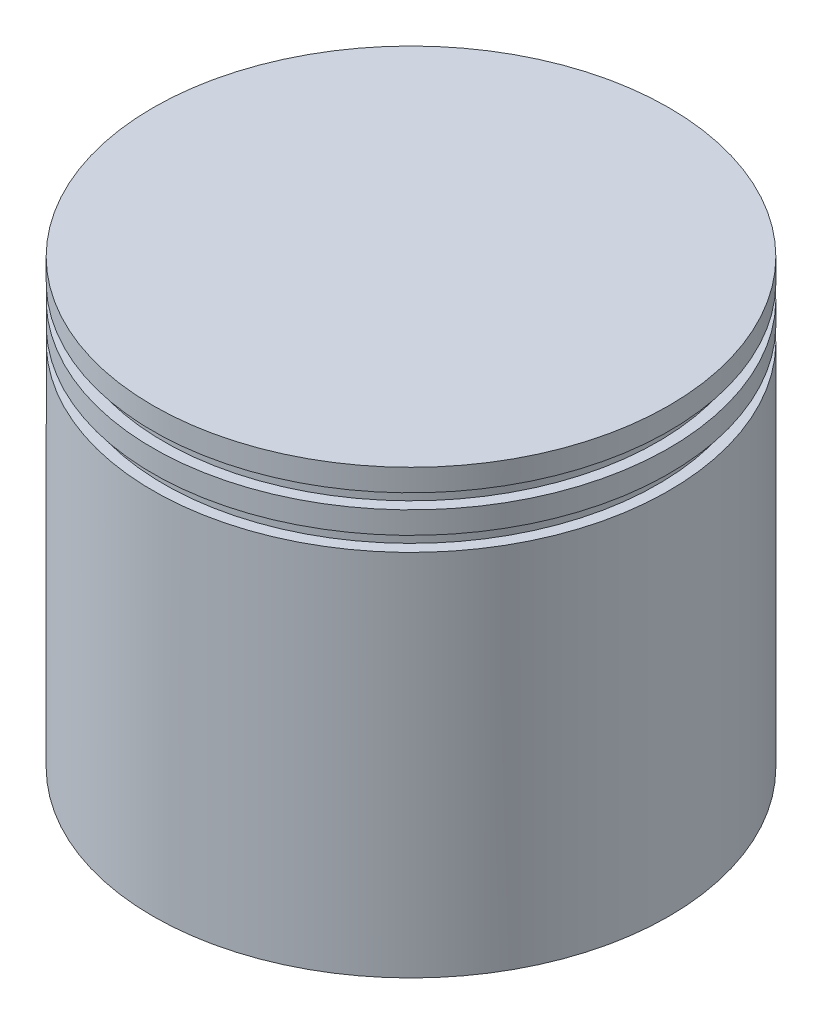
ISO-10303-21;
HEADER;
FILE_DESCRIPTION(('STEP AP214'),'2;1');
FILE_NAME('part.step','',(''),(''),'','','');
FILE_SCHEMA(('AUTOMOTIVE_DESIGN { 1 0 10303 214 1 1 1 1 }'));
ENDSEC;
DATA;
#1=APPLICATION_CONTEXT('core data for automotive mechanical design processes');
#2=APPLICATION_PROTOCOL_DEFINITION('international standard','automotive_design',2000,#1);
#3=PRODUCT_CONTEXT('',#1,'mechanical');
#4=PRODUCT('Part','Part','',(#3));
#5=PRODUCT_RELATED_PRODUCT_CATEGORY('part','',(#4));
#6=PRODUCT_DEFINITION_FORMATION('','',#4);
#7=PRODUCT_DEFINITION_CONTEXT('part definition',#1,'design');
#8=PRODUCT_DEFINITION('design','',#6,#7);
#9=PRODUCT_DEFINITION_SHAPE('','',#8);
#10=(LENGTH_UNIT() NAMED_UNIT(*) SI_UNIT(.MILLI.,.METRE.));
#11=(NAMED_UNIT(*) PLANE_ANGLE_UNIT() SI_UNIT($,.RADIAN.));
#12=(NAMED_UNIT(*) SI_UNIT($,.STERADIAN.) SOLID_ANGLE_UNIT());
#13=UNCERTAINTY_MEASURE_WITH_UNIT(LENGTH_MEASURE(1.E-05),#10,'distance_accuracy_value','');
#14=(GEOMETRIC_REPRESENTATION_CONTEXT(3) GLOBAL_UNCERTAINTY_ASSIGNED_CONTEXT((#13)) GLOBAL_UNIT_ASSIGNED_CONTEXT((#10,
#11,#12)) REPRESENTATION_CONTEXT('',''));
#15=CARTESIAN_POINT('',(0.,0.,0.));
#16=DIRECTION('',(0.,0.,1.));
#17=DIRECTION('',(1.,0.,0.));
#18=AXIS2_PLACEMENT_3D('',#15,#16,#17);
#19=CARTESIAN_POINT('',(0.,60.,0.));
#20=DIRECTION('',(0.,-1.,0.));
#21=DIRECTION('',(0.,0.,-1.));
#22=AXIS2_PLACEMENT_3D('',#19,#20,#21);
#23=CYLINDRICAL_SURFACE('',#22,35.);
#24=CARTESIAN_POINT('',(0.,55.,0.));
#25=DIRECTION('',(0.,-1.,0.));
#26=DIRECTION('',(0.,0.,-1.));
#27=AXIS2_PLACEMENT_3D('',#24,#25,#26);
#28=CIRCLE('',#27,35.);
#29=CARTESIAN_POINT('',(0.,55.,-35.));
#30=VERTEX_POINT('',#29);
#31=EDGE_CURVE('E123',#30,#30,#28,.T.);
#32=ORIENTED_EDGE('',*,*,#31,.T.);
#33=EDGE_LOOP('',(#32));
#34=FACE_BOUND('',#33,.T.);
#35=CARTESIAN_POINT('',(0.,52.,0.));
#36=DIRECTION('',(0.,-1.,0.));
#37=DIRECTION('',(0.,0.,-1.));
#38=AXIS2_PLACEMENT_3D('',#35,#36,#37);
#39=CIRCLE('',#38,35.);
#40=CARTESIAN_POINT('',(0.,52.,-35.));
#41=VERTEX_POINT('',#40);
#42=EDGE_CURVE('E165',#41,#41,#39,.T.);
#43=ORIENTED_EDGE('',*,*,#42,.F.);
#44=EDGE_LOOP('',(#43));
#45=FACE_BOUND('',#44,.T.);
#46=ADVANCED_FACE('F36',(#34,#45),#23,.T.);
#47=CARTESIAN_POINT('',(0.,47.5422284208895,0.));
#48=DIRECTION('',(0.,-1.,0.));
#49=DIRECTION('',(0.,0.,-1.));
#50=AXIS2_PLACEMENT_3D('',#47,#48,#49);
#51=CYLINDRICAL_SURFACE('',#50,33.5);
#52=CARTESIAN_POINT('',(0.,57.,0.));
#53=DIRECTION('',(0.,-1.,0.));
#54=DIRECTION('',(0.,0.,-1.));
#55=AXIS2_PLACEMENT_3D('',#52,#53,#54);
#56=CIRCLE('',#55,33.5);
#57=CARTESIAN_POINT('',(0.,57.,-33.5));
#58=VERTEX_POINT('',#57);
#59=EDGE_CURVE('E122',#58,#58,#56,.T.);
#60=ORIENTED_EDGE('',*,*,#59,.T.);
#61=EDGE_LOOP('',(#60));
#62=FACE_BOUND('',#61,.T.);
#63=CARTESIAN_POINT('',(0.,55.,0.));
#64=DIRECTION('',(0.,-1.,0.));
#65=DIRECTION('',(0.,0.,-1.));
#66=AXIS2_PLACEMENT_3D('',#63,#64,#65);
#67=CIRCLE('',#66,33.5);
#68=CARTESIAN_POINT('',(0.,55.,-33.5));
#69=VERTEX_POINT('',#68);
#70=EDGE_CURVE('E128',#69,#69,#67,.T.);
#71=ORIENTED_EDGE('',*,*,#70,.F.);
#72=EDGE_LOOP('',(#71));
#73=FACE_BOUND('',#72,.T.);
#74=ADVANCED_FACE('F92',(#62,#73),#51,.T.);
#75=CARTESIAN_POINT('',(-33.5,57.,0.));
#76=DIRECTION('',(0.,-1.,0.));
#77=DIRECTION('',(0.,0.,-1.));
#78=AXIS2_PLACEMENT_3D('',#75,#76,#77);
#79=PLANE('',#78);
#80=CARTESIAN_POINT('',(0.,57.,0.));
#81=DIRECTION('',(0.,-1.,0.));
#82=DIRECTION('',(0.,0.,-1.));
#83=AXIS2_PLACEMENT_3D('',#80,#81,#82);
#84=CIRCLE('',#83,35.);
#85=CARTESIAN_POINT('',(0.,57.,-35.));
#86=VERTEX_POINT('',#85);
#87=EDGE_CURVE('E120',#86,#86,#84,.T.);
#88=ORIENTED_EDGE('',*,*,#87,.T.);
#89=EDGE_LOOP('',(#88));
#90=FACE_BOUND('',#89,.T.);
#91=ORIENTED_EDGE('',*,*,#59,.F.);
#92=EDGE_LOOP('',(#91));
#93=FACE_BOUND('',#92,.T.);
#94=ADVANCED_FACE('F98',(#90,#93),#79,.T.);
#95=CARTESIAN_POINT('',(-35.,55.,0.));
#96=DIRECTION('',(0.,1.,0.));
#97=DIRECTION('',(0.,0.,1.));
#98=AXIS2_PLACEMENT_3D('',#95,#96,#97);
#99=PLANE('',#98);
#100=ORIENTED_EDGE('',*,*,#70,.T.);
#101=EDGE_LOOP('',(#100));
#102=FACE_BOUND('',#101,.T.);
#103=ORIENTED_EDGE('',*,*,#31,.F.);
#104=EDGE_LOOP('',(#103));
#105=FACE_BOUND('',#104,.T.);
#106=ADVANCED_FACE('F116',(#102,#105),#99,.T.);
#107=CARTESIAN_POINT('',(0.,60.,0.));
#108=DIRECTION('',(0.,1.,0.));
#109=DIRECTION('',(0.,0.,1.));
#110=AXIS2_PLACEMENT_3D('',#107,#108,#109);
#111=PLANE('',#110);
#112=CARTESIAN_POINT('',(0.,60.,0.));
#113=DIRECTION('',(0.,1.,0.));
#114=DIRECTION('',(0.,0.,1.));
#115=AXIS2_PLACEMENT_3D('',#112,#113,#114);
#116=CIRCLE('',#115,35.);
#117=CARTESIAN_POINT('',(0.,60.,35.));
#118=VERTEX_POINT('',#117);
#119=EDGE_CURVE('E10',#118,#118,#116,.T.);
#120=ORIENTED_EDGE('',*,*,#119,.T.);
#121=EDGE_LOOP('',(#120));
#122=FACE_BOUND('',#121,.T.);
#123=ADVANCED_FACE('F107',(#122),#111,.T.);
#124=ORIENTED_EDGE('',*,*,#119,.F.);
#125=EDGE_LOOP('',(#124));
#126=FACE_BOUND('',#125,.T.);
#127=ORIENTED_EDGE('',*,*,#87,.F.);
#128=EDGE_LOOP('',(#127));
#129=FACE_BOUND('',#128,.T.);
#130=ADVANCED_FACE('F38',(#126,#129),#23,.T.);
#131=CARTESIAN_POINT('',(0.,47.5422284208895,0.));
#132=DIRECTION('',(0.,-1.,0.));
#133=DIRECTION('',(0.,0.,-1.));
#134=AXIS2_PLACEMENT_3D('',#131,#132,#133);
#135=CYLINDRICAL_SURFACE('',#134,33.5);
#136=CARTESIAN_POINT('',(0.,52.,0.));
#137=DIRECTION('',(0.,-1.,0.));
#138=DIRECTION('',(0.,0.,-1.));
#139=AXIS2_PLACEMENT_3D('',#136,#137,#138);
#140=CIRCLE('',#139,33.5);
#141=CARTESIAN_POINT('',(0.,52.,-33.5));
#142=VERTEX_POINT('',#141);
#143=EDGE_CURVE('E168',#142,#142,#140,.T.);
#144=ORIENTED_EDGE('',*,*,#143,.T.);
#145=EDGE_LOOP('',(#144));
#146=FACE_BOUND('',#145,.T.);
#147=CARTESIAN_POINT('',(0.,50.,0.));
#148=DIRECTION('',(0.,-1.,0.));
#149=DIRECTION('',(0.,0.,-1.));
#150=AXIS2_PLACEMENT_3D('',#147,#148,#149);
#151=CIRCLE('',#150,33.5);
#152=CARTESIAN_POINT('',(0.,50.,-33.5));
#153=VERTEX_POINT('',#152);
#154=EDGE_CURVE('E160',#153,#153,#151,.T.);
#155=ORIENTED_EDGE('',*,*,#154,.F.);
#156=EDGE_LOOP('',(#155));
#157=FACE_BOUND('',#156,.T.);
#158=ADVANCED_FACE('F106',(#146,#157),#135,.T.);
#159=CARTESIAN_POINT('',(-33.5,52.,0.));
#160=DIRECTION('',(0.,-1.,0.));
#161=DIRECTION('',(0.,0.,-1.));
#162=AXIS2_PLACEMENT_3D('',#159,#160,#161);
#163=PLANE('',#162);
#164=ORIENTED_EDGE('',*,*,#42,.T.);
#165=EDGE_LOOP('',(#164));
#166=FACE_BOUND('',#165,.T.);
#167=ORIENTED_EDGE('',*,*,#143,.F.);
#168=EDGE_LOOP('',(#167));
#169=FACE_BOUND('',#168,.T.);
#170=ADVANCED_FACE('F113',(#166,#169),#163,.T.);
#171=CARTESIAN_POINT('',(-35.,50.,0.));
#172=DIRECTION('',(0.,1.,0.));
#173=DIRECTION('',(0.,0.,1.));
#174=AXIS2_PLACEMENT_3D('',#171,#172,#173);
#175=PLANE('',#174);
#176=ORIENTED_EDGE('',*,*,#154,.T.);
#177=EDGE_LOOP('',(#176));
#178=FACE_BOUND('',#177,.T.);
#179=CARTESIAN_POINT('',(0.,50.,0.));
#180=DIRECTION('',(0.,-1.,0.));
#181=DIRECTION('',(0.,0.,-1.));
#182=AXIS2_PLACEMENT_3D('',#179,#180,#181);
#183=CIRCLE('',#182,35.);
#184=CARTESIAN_POINT('',(0.,50.,-35.));
#185=VERTEX_POINT('',#184);
#186=EDGE_CURVE('E163',#185,#185,#183,.T.);
#187=ORIENTED_EDGE('',*,*,#186,.F.);
#188=EDGE_LOOP('',(#187));
#189=FACE_BOUND('',#188,.T.);
#190=ADVANCED_FACE('F149',(#178,#189),#175,.T.);
#191=CARTESIAN_POINT('',(-8.,15.,0.));
#192=DIRECTION('',(1.,0.,0.));
#193=DIRECTION('',(0.,0.,-1.));
#194=AXIS2_PLACEMENT_3D('',#191,#192,#193);
#195=CYLINDRICAL_SURFACE('',#194,3.);
#196=CARTESIAN_POINT('',(-8.,15.,0.));
#197=DIRECTION('',(1.,0.,0.));
#198=DIRECTION('',(0.,0.,-1.));
#199=AXIS2_PLACEMENT_3D('',#196,#197,#198);
#200=CIRCLE('',#199,3.);
#201=CARTESIAN_POINT('',(-8.,15.,-3.));
#202=VERTEX_POINT('',#201);
#203=EDGE_CURVE('E65',#202,#202,#200,.T.);
#204=ORIENTED_EDGE('',*,*,#203,.T.);
#205=EDGE_LOOP('',(#204));
#206=FACE_BOUND('',#205,.T.);
#207=CARTESIAN_POINT('',(8.,15.,0.));
#208=DIRECTION('',(1.,0.,0.));
#209=DIRECTION('',(0.,0.,-1.));
#210=AXIS2_PLACEMENT_3D('',#207,#208,#209);
#211=CIRCLE('',#210,3.);
#212=CARTESIAN_POINT('',(8.,15.,-3.));
#213=VERTEX_POINT('',#212);
#214=EDGE_CURVE('E188',#213,#213,#211,.T.);
#215=ORIENTED_EDGE('',*,*,#214,.F.);
#216=EDGE_LOOP('',(#215));
#217=FACE_BOUND('',#216,.T.);
#218=ADVANCED_FACE('F73',(#206,#217),#195,.T.);
#219=CARTESIAN_POINT('',(8.,15.,0.));
#220=DIRECTION('',(1.,0.,0.));
#221=DIRECTION('',(0.,0.,1.));
#222=AXIS2_PLACEMENT_3D('',#219,#220,#221);
#223=PLANE('',#222);
#224=ORIENTED_EDGE('',*,*,#214,.T.);
#225=EDGE_LOOP('',(#224));
#226=FACE_BOUND('',#225,.T.);
#227=CARTESIAN_POINT('',(8.,15.,0.));
#228=DIRECTION('',(-1.,0.,0.));
#229=DIRECTION('',(0.,0.,1.));
#230=AXIS2_PLACEMENT_3D('',#227,#228,#229);
#231=CIRCLE('',#230,6.);
#232=CARTESIAN_POINT('',(8.,15.,6.));
#233=VERTEX_POINT('',#232);
#234=EDGE_CURVE('E137',#233,#233,#231,.T.);
#235=ORIENTED_EDGE('',*,*,#234,.T.);
#236=EDGE_LOOP('',(#235));
#237=FACE_BOUND('',#236,.T.);
#238=ADVANCED_FACE('F78',(#226,#237),#223,.F.);
#239=CARTESIAN_POINT('',(-8.,15.,0.));
#240=DIRECTION('',(-1.,0.,0.));
#241=DIRECTION('',(0.,0.,1.));
#242=AXIS2_PLACEMENT_3D('',#239,#240,#241);
#243=PLANE('',#242);
#244=ORIENTED_EDGE('',*,*,#203,.F.);
#245=EDGE_LOOP('',(#244));
#246=FACE_BOUND('',#245,.T.);
#247=CARTESIAN_POINT('',(-8.,15.,0.));
#248=DIRECTION('',(-1.,0.,0.));
#249=DIRECTION('',(0.,0.,1.));
#250=AXIS2_PLACEMENT_3D('',#247,#248,#249);
#251=CIRCLE('',#250,6.);
#252=CARTESIAN_POINT('',(-8.,15.,6.));
#253=VERTEX_POINT('',#252);
#254=EDGE_CURVE('E55',#253,#253,#251,.T.);
#255=ORIENTED_EDGE('',*,*,#254,.F.);
#256=EDGE_LOOP('',(#255));
#257=FACE_BOUND('',#256,.T.);
#258=ADVANCED_FACE('F75',(#246,#257),#243,.F.);
#259=CARTESIAN_POINT('',(8.,15.,0.));
#260=DIRECTION('',(1.,0.,0.));
#261=DIRECTION('',(0.,0.,1.));
#262=AXIS2_PLACEMENT_3D('',#259,#260,#261);
#263=CONICAL_SURFACE('',#262,6.,0.139626340159547);
#264=CARTESIAN_POINT('',(31.2669133575195,8.71097222824434,-6.81029581540872));
#265=CARTESIAN_POINT('',(31.2289270924786,8.90769739943283,-6.98469552802213));
#266=CARTESIAN_POINT('',(31.19121991681,9.11186141180421,-7.15079573593364));
#267=CARTESIAN_POINT('',(31.1174354036274,9.533663360001,-7.46534165270167));
#268=CARTESIAN_POINT('',(31.081358249566,9.75130280593344,-7.61378537744265));
#269=CARTESIAN_POINT('',(31.0118555768524,10.198677203922,-7.89211016960158));
#270=CARTESIAN_POINT('',(30.97843114749,10.4284170610137,-8.02198362887102));
#271=CARTESIAN_POINT('',(30.9152262136057,10.8983571251811,-8.26221664255108));
#272=CARTESIAN_POINT('',(30.8854456068352,11.1385570384824,-8.37257674456163));
#273=CARTESIAN_POINT('',(30.8303913121144,11.6279783769724,-8.57308563298544));
#274=CARTESIAN_POINT('',(30.8051212135618,11.877206798878,-8.66321833727193));
#275=CARTESIAN_POINT('',(30.7598864750898,12.3827607284156,-8.82248520301029));
#276=CARTESIAN_POINT('',(30.7399218730203,12.6390862866648,-8.89161921465627));
#277=CARTESIAN_POINT('',(30.705923661776,13.1569162619396,-9.00832677718765));
#278=CARTESIAN_POINT('',(30.6918884535173,13.4184192627315,-9.05590614134431));
#279=CARTESIAN_POINT('',(30.6701852981001,13.944737653792,-9.12914004789619));
#280=CARTESIAN_POINT('',(30.6625172204194,14.2095529760472,-9.15479503972732));
#281=CARTESIAN_POINT('',(30.6538803437074,14.7351691794445,-9.18367245246466));
#282=CARTESIAN_POINT('',(30.6527800163904,14.9959437931424,-9.18733530527482));
#283=CARTESIAN_POINT('',(30.6569612208767,15.5168688451235,-9.17337354330755));
#284=CARTESIAN_POINT('',(30.6622426710724,15.7770192913456,-9.15574920074187));
#285=CARTESIAN_POINT('',(30.6790248804172,16.2948149154097,-9.09935680214171));
#286=CARTESIAN_POINT('',(30.6905256832861,16.5524600756276,-9.06058859747375));
#287=CARTESIAN_POINT('',(30.7193958220612,17.0634051831135,-8.9622175300404));
#288=CARTESIAN_POINT('',(30.7367651714537,17.3167051203945,-8.90261461939552));
#289=CARTESIAN_POINT('',(30.7766912289919,17.8152051606238,-8.76358706988813));
#290=CARTESIAN_POINT('',(30.7992057482668,18.0604535372428,-8.68432321660905));
#291=CARTESIAN_POINT('',(30.8488521604924,18.5433784042536,-8.50628340685762));
#292=CARTESIAN_POINT('',(30.8759857242126,18.7810521177272,-8.40750038795919));
#293=CARTESIAN_POINT('',(30.9340913110962,19.2471695442164,-8.19112536964277));
#294=CARTESIAN_POINT('',(30.9650631160527,19.4756137809566,-8.07353443935858));
#295=CARTESIAN_POINT('',(31.0299848578224,19.9218330131113,-7.82030168427036));
#296=CARTESIAN_POINT('',(31.0639349225328,20.1396075497044,-7.68465908413382));
#297=CARTESIAN_POINT('',(31.1347044720203,20.5680647633367,-7.39278331221115));
#298=CARTESIAN_POINT('',(31.1715725669782,20.7784614965762,-7.23614197635073));
#299=CARTESIAN_POINT('',(31.2464135325355,21.1852160179394,-6.90581726846753));
#300=CARTESIAN_POINT('',(31.2843864196427,21.3815735961396,-6.73213364170826));
#301=CARTESIAN_POINT('',(31.3603769925228,21.7589263925239,-6.36876774160822));
#302=CARTESIAN_POINT('',(31.3983946833646,21.9399196600656,-6.17908344290974));
#303=CARTESIAN_POINT('',(31.4734029882944,22.2852144180093,-5.78490659135343));
#304=CARTESIAN_POINT('',(31.5103936465101,22.4495166263711,-5.58041467608841));
#305=CARTESIAN_POINT('',(31.5825489611336,22.7612446961346,-5.15646545956778));
#306=CARTESIAN_POINT('',(31.6176996367911,22.9085494037604,-4.9369166174229));
#307=CARTESIAN_POINT('',(31.6848737151155,23.1837337285917,-4.48562056980855));
#308=CARTESIAN_POINT('',(31.7168983242673,23.3116208505563,-4.25387812395071));
#309=CARTESIAN_POINT('',(31.7768917146779,23.5469128783071,-3.77971550459227));
#310=CARTESIAN_POINT('',(31.8048606217437,23.65431841946,-3.53729566260641));
#311=CARTESIAN_POINT('',(31.8559018759286,23.8476380938969,-3.04353393683381));
#312=CARTESIAN_POINT('',(31.8789744346647,23.9335531560146,-2.79219243918367));
#313=CARTESIAN_POINT('',(31.9187201774835,24.0800999001998,-2.29251625603737));
#314=CARTESIAN_POINT('',(31.935609002169,24.1415916372772,-2.04445079641348));
#315=CARTESIAN_POINT('',(31.9637277268952,24.2433490452008,-1.54369156247682));
#316=CARTESIAN_POINT('',(31.9749578809718,24.2836156689139,-1.29099799646245));
#317=CARTESIAN_POINT('',(31.9914291642399,24.3425111733418,-0.78296642076948));
#318=CARTESIAN_POINT('',(31.9966716876353,24.3611450911909,-0.527629040674232));
#319=CARTESIAN_POINT('',(32.0010173398055,24.3765987135603,-0.0162451611186606));
#320=CARTESIAN_POINT('',(32.0001206272969,24.3734189820248,0.239801319838341));
#321=CARTESIAN_POINT('',(31.9923821151938,24.3458738480936,0.73984494363145));
#322=CARTESIAN_POINT('',(31.9857919395917,24.3224050948655,0.983895944246808));
#323=CARTESIAN_POINT('',(31.9671794513667,24.2556952280171,1.46915323440687));
#324=CARTESIAN_POINT('',(31.9551553352124,24.2124475496911,1.7103585521706));
#325=CARTESIAN_POINT('',(31.9259994389556,24.1065868190905,2.18811098652399));
#326=CARTESIAN_POINT('',(31.9088686644044,24.0439775792072,2.424659010414));
#327=CARTESIAN_POINT('',(31.8699500960674,23.8999425987695,2.89156874250842));
#328=CARTESIAN_POINT('',(31.8481620625241,23.8185158894674,3.12193013153505));
#329=CARTESIAN_POINT('',(31.8003408081456,23.6369499435649,3.57643418760785));
#330=CARTESIAN_POINT('',(31.7742811319443,23.5366934862926,3.80052720584974));
#331=CARTESIAN_POINT('',(31.7186883971965,23.3186219582311,4.23954868759276));
#332=CARTESIAN_POINT('',(31.6891552677275,23.2008065289025,4.45447696384226));
#333=CARTESIAN_POINT('',(31.6273576285827,22.9484862742698,4.87393097580871));
#334=CARTESIAN_POINT('',(31.5950926862895,22.8139788039918,5.07845505564807));
#335=CARTESIAN_POINT('',(31.5286369698554,22.5292358097785,5.47591628048144));
#336=CARTESIAN_POINT('',(31.4944461136729,22.3789996155835,5.66885293114001));
#337=CARTESIAN_POINT('',(31.4233755379448,22.0565234370966,6.05069465116879));
#338=CARTESIAN_POINT('',(31.3864445346649,21.883588183973,6.23900335816001));
#339=CARTESIAN_POINT('',(31.3123797219467,21.5227885872562,6.6006787578219));
#340=CARTESIAN_POINT('',(31.2752459115385,21.3349241722041,6.77404537896362));
#341=CARTESIAN_POINT('',(31.2017567056485,20.9454583196754,7.10486466463057));
#342=CARTESIAN_POINT('',(31.1654014765316,20.7438539840343,7.26231395420835));
#343=CARTESIAN_POINT('',(31.0944530499085,20.328238620007,7.56032124850495));
#344=CARTESIAN_POINT('',(31.05985983475,20.1142277159582,7.70087942246162));
#345=CARTESIAN_POINT('',(30.9922503198093,19.6677288384447,7.96869769491035));
#346=CARTESIAN_POINT('',(30.9593266946461,19.4348609843097,8.09534858822398));
#347=CARTESIAN_POINT('',(30.8973485212326,18.9589780163798,8.32877182173417));
#348=CARTESIAN_POINT('',(30.8682925689245,18.7159666272454,8.43555138133478));
#349=CARTESIAN_POINT('',(30.8149073824114,18.2213697863034,8.62852913199059));
#350=CARTESIAN_POINT('',(30.7905786072819,17.9697835045388,8.71472532429681));
#351=CARTESIAN_POINT('',(30.7474006685858,17.4598474317218,8.8658635920297));
#352=CARTESIAN_POINT('',(30.7285513927962,17.2014977793051,8.93080610274655));
#353=CARTESIAN_POINT('',(30.6971028830649,16.6828718877164,9.03830620429702));
#354=CARTESIAN_POINT('',(30.6844352431112,16.4226506578031,9.08110912528261));
#355=CARTESIAN_POINT('',(30.6654287877197,15.8993319943191,9.14508585342006));
#356=CARTESIAN_POINT('',(30.6590899378235,15.6362345764165,9.1662597783355));
#357=CARTESIAN_POINT('',(30.6529411829611,15.1091437561746,9.18680099756125));
#358=CARTESIAN_POINT('',(30.6531305302854,14.8451504599083,9.18617078921619));
#359=CARTESIAN_POINT('',(30.660030462963,14.3182055328942,9.16311500125505));
#360=CARTESIAN_POINT('',(30.6667409677139,14.0552538893116,9.14068969102925));
#361=CARTESIAN_POINT('',(30.6862635258484,13.5378402476333,9.07493109132999));
#362=CARTESIAN_POINT('',(30.6989443315491,13.2833159911674,9.03204729237255));
#363=CARTESIAN_POINT('',(30.7299730516425,12.7789094187389,8.92590663147942));
#364=CARTESIAN_POINT('',(30.748320878986,12.5290270315366,8.86265008248173));
#365=CARTESIAN_POINT('',(30.7901423151838,12.035629941272,8.71624486860085));
#366=CARTESIAN_POINT('',(30.8136154316446,11.7921146290309,8.63309811452366));
#367=CARTESIAN_POINT('',(30.8650213358647,11.3129533374161,8.44746881121354));
#368=CARTESIAN_POINT('',(30.89295580469,11.0773103650226,8.34497897072685));
#369=CARTESIAN_POINT('',(30.9528564982914,10.6126682287624,8.11999908722804));
#370=CARTESIAN_POINT('',(30.9848681754406,10.3837867616586,7.997278087589));
#371=CARTESIAN_POINT('',(31.051751702352,9.93716221046358,7.73351318746147));
#372=CARTESIAN_POINT('',(31.0866246202979,9.71942333593404,7.59246243236665));
#373=CARTESIAN_POINT('',(31.1582391908304,9.29663991670172,7.2929978958213));
#374=CARTESIAN_POINT('',(31.1949803851802,9.09159228628137,7.13458836109771));
#375=CARTESIAN_POINT('',(31.2693452043964,8.69538686368291,6.80126570816783));
#376=CARTESIAN_POINT('',(31.3069692308689,8.50423556167469,6.62634496508058));
#377=CARTESIAN_POINT('',(31.382852921056,8.13330874251123,6.25721874428566));
#378=CARTESIAN_POINT('',(31.4211090822171,7.95386168707689,6.06268220485738));
#379=CARTESIAN_POINT('',(31.4963398994854,7.61230883397021,5.6588626444497));
#380=CARTESIAN_POINT('',(31.533315146892,7.45019496080071,5.44958656664231));
#381=CARTESIAN_POINT('',(31.6049529737248,7.14441648765895,5.01746166933311));
#382=CARTESIAN_POINT('',(31.6396146760262,7.00075886605385,4.79460776268793));
#383=CARTESIAN_POINT('',(31.7055835050814,6.73322213670183,4.3369784861628));
#384=CARTESIAN_POINT('',(31.736892101811,6.60933435024234,4.10220840732442));
#385=CARTESIAN_POINT('',(31.7946671427779,6.38460511494442,3.62702200533219));
#386=CARTESIAN_POINT('',(31.8212167255224,6.28335824298906,3.38680760705423));
#387=CARTESIAN_POINT('',(31.869430523408,6.10183459778511,2.89821053401953));
#388=CARTESIAN_POINT('',(31.8910967506215,6.02154918568938,2.64983127191789));
#389=CARTESIAN_POINT('',(31.9289109313163,5.88268795760115,2.14669033946648));
#390=CARTESIAN_POINT('',(31.9450595013453,5.82410971596931,1.89192938562909));
#391=CARTESIAN_POINT('',(31.9713519772954,5.72925446620192,1.37798555126154));
#392=CARTESIAN_POINT('',(31.9814961381737,5.69297651115705,1.11880285896653));
#393=CARTESIAN_POINT('',(31.9951282729915,5.64432450605247,0.610847377174154));
#394=CARTESIAN_POINT('',(31.9989176712889,5.63086760734914,0.362185814694014));
#395=CARTESIAN_POINT('',(32.0006805735169,5.62460045988967,-0.135416099335626));
#396=CARTESIAN_POINT('',(31.9986542144152,5.63178972489249,-0.384356444181456));
#397=CARTESIAN_POINT('',(31.988842462799,5.66674319211337,-0.880660941853176));
#398=CARTESIAN_POINT('',(31.9810573025178,5.69450656464603,-1.1280251578334));
#399=CARTESIAN_POINT('',(31.9599449881652,5.77033781303555,-1.6193783551113));
#400=CARTESIAN_POINT('',(31.9466178539269,5.81840561622943,-1.86336734848458));
#401=CARTESIAN_POINT('',(31.9150803447505,5.93332974493643,-2.34181069185626));
#402=CARTESIAN_POINT('',(31.8969637235964,5.99982642098109,-2.57635780813148));
#403=CARTESIAN_POINT('',(31.8562098728452,6.15139767013774,-3.03905458919401));
#404=CARTESIAN_POINT('',(31.833571042979,6.23647882071752,-3.26720195662338));
#405=CARTESIAN_POINT('',(31.7843714986202,6.42444973292826,-3.71544702950519));
#406=CARTESIAN_POINT('',(31.7578128791119,6.52732998661721,-3.935548957029));
#407=CARTESIAN_POINT('',(31.7014237781234,6.75016568746882,-4.3665762460893));
#408=CARTESIAN_POINT('',(31.6715923388964,6.87012613599691,-4.5774988960773));
#409=CARTESIAN_POINT('',(31.6119739100872,7.11562936854916,-4.97187467587696));
#410=CARTESIAN_POINT('',(31.582386963535,7.23989164472569,-5.15615743863837));
#411=CARTESIAN_POINT('',(31.5216922579737,7.50130924740845,-5.5150742431728));
#412=CARTESIAN_POINT('',(31.4905845032737,7.6384645373857,-5.68970831228065));
#413=CARTESIAN_POINT('',(31.4274698293683,7.92495789544877,-6.02858674368817));
#414=CARTESIAN_POINT('',(31.3954626703068,8.07429923395832,-6.19282829576587));
#415=CARTESIAN_POINT('',(31.3312085457334,8.38432083410536,-6.51011302325786));
#416=CARTESIAN_POINT('',(31.2989616241946,8.54499906028,-6.66315819890725));
#417=CARTESIAN_POINT('',(31.2669133575195,8.71097222824434,-6.81029581540872));
#418=B_SPLINE_CURVE_WITH_KNOTS('',3,(#264,#265,#266,#267,#268,#269,#270,#271,#272,#273,#274,
#275,#276,#277,#278,#279,#280,#281,#282,#283,#284,#285,#286,#287,#288,#289,#290,#291,#292,#293,
#294,#295,#296,#297,#298,#299,#300,#301,#302,#303,#304,#305,#306,#307,#308,#309,#310,#311,#312,
#313,#314,#315,#316,#317,#318,#319,#320,#321,#322,#323,#324,#325,#326,#327,#328,#329,#330,#331,
#332,#333,#334,#335,#336,#337,#338,#339,#340,#341,#342,#343,#344,#345,#346,#347,#348,#349,#350,
#351,#352,#353,#354,#355,#356,#357,#358,#359,#360,#361,#362,#363,#364,#365,#366,#367,#368,#369,
#370,#371,#372,#373,#374,#375,#376,#377,#378,#379,#380,#381,#382,#383,#384,#385,#386,#387,#388,
#389,#390,#391,#392,#393,#394,#395,#396,#397,#398,#399,#400,#401,#402,#403,#404,#405,#406,#407,
#408,#409,#410,#411,#412,#413,#414,#415,#416,#417),.UNSPECIFIED.,.T.,.F.,(4,2,2,2,2,2,2,2,2,2,2,
2,2,2,2,2,2,2,2,2,2,2,2,2,2,2,2,2,2,2,2,2,2,2,2,2,2,2,2,2,2,2,2,2,2,2,2,2,2,2,2,2,2,2,2,2,2,2,2,
2,2,2,2,2,2,2,2,2,2,2,2,2,2,2,2,2,4),(0.,0.796691179799454,1.59347180192511,2.39057793161639,
3.18766168870689,3.98537695273893,4.78309790758442,5.58060358945436,6.37809292256451,
7.15955636811456,7.94100982074265,8.72246876676807,9.50392950864819,10.2791988679572,
11.0547492506305,11.8302555628797,12.6057951944529,13.39951607318,14.19324881771,
14.9870821837643,15.7808813888978,16.580028444825,17.378865845533,18.1776784611761,
18.9764565456055,19.7438808725294,20.5112707442501,21.2784818948363,22.0456732109272,
22.780598077829,23.5157670465063,24.2507913487059,24.9858534993492,25.7256531562715,
26.465467921352,27.2054000654508,27.9453637536681,28.7194558925827,29.4935517369312,
30.26781136988,31.0420632446103,31.8424559933629,32.6425573833203,33.4427364356014,
34.2428990986333,35.033994173664,35.8250849413892,36.6160851015348,37.4070754849408,
38.1814357614237,38.9557841438225,39.730058166216,40.5046246313219,41.2887386438351,
42.0731467324849,42.8573633467726,43.6419439010083,44.443213266389,45.2441076800836,
46.0453040288195,46.8461476889591,47.6312372143843,48.4160026682625,49.2006804030897,
49.9853248168208,50.7315732928,51.477804193908,52.2240050036405,52.9702031429847,
53.702755949302,54.4355684440047,55.1679906861122,55.9006278364005,56.5727218881942,
57.2448140358421,57.917087152841,58.5892398733176),.UNSPECIFIED.);
#419=CARTESIAN_POINT('',(31.2669133575195,8.71097222824434,-6.81029581540872));
#420=VERTEX_POINT('',#419);
#421=EDGE_CURVE('E126',#420,#420,#418,.T.);
#422=ORIENTED_EDGE('',*,*,#421,.F.);
#423=EDGE_LOOP('',(#422));
#424=FACE_BOUND('',#423,.T.);
#425=ORIENTED_EDGE('',*,*,#234,.F.);
#426=EDGE_LOOP('',(#425));
#427=FACE_BOUND('',#426,.T.);
#428=ADVANCED_FACE('F77',(#424,#427),#263,.T.);
#429=CARTESIAN_POINT('',(0.,57.,0.));
#430=DIRECTION('',(0.,1.,0.));
#431=DIRECTION('',(0.,0.,1.));
#432=AXIS2_PLACEMENT_3D('',#429,#430,#431);
#433=PLANE('',#432);
#434=CARTESIAN_POINT('',(0.,57.,0.));
#435=DIRECTION('',(0.,1.,0.));
#436=DIRECTION('',(0.,0.,1.));
#437=AXIS2_PLACEMENT_3D('',#434,#435,#436);
#438=CIRCLE('',#437,32.);
#439=CARTESIAN_POINT('',(0.,57.,32.));
#440=VERTEX_POINT('',#439);
#441=EDGE_CURVE('E47',#440,#440,#438,.T.);
#442=ORIENTED_EDGE('',*,*,#441,.F.);
#443=EDGE_LOOP('',(#442));
#444=FACE_BOUND('',#443,.T.);
#445=ADVANCED_FACE('F84',(#444),#433,.F.);
#446=CARTESIAN_POINT('',(-8.,15.,0.));
#447=DIRECTION('',(-1.,0.,0.));
#448=DIRECTION('',(0.,0.,1.));
#449=AXIS2_PLACEMENT_3D('',#446,#447,#448);
#450=CONICAL_SURFACE('',#449,6.,0.139626340159547);
#451=CARTESIAN_POINT('',(-31.2669133575195,8.71097222824434,-6.81029581540872));
#452=CARTESIAN_POINT('',(-31.2289270924786,8.90769739943283,-6.98469552802213));
#453=CARTESIAN_POINT('',(-31.19121991681,9.11186141180421,-7.15079573593364));
#454=CARTESIAN_POINT('',(-31.1174354036274,9.533663360001,-7.46534165270167));
#455=CARTESIAN_POINT('',(-31.081358249566,9.75130280593344,-7.61378537744265));
#456=CARTESIAN_POINT('',(-31.0118555768524,10.198677203922,-7.89211016960158));
#457=CARTESIAN_POINT('',(-30.97843114749,10.4284170610137,-8.02198362887102));
#458=CARTESIAN_POINT('',(-30.9152262136057,10.8983571251811,-8.26221664255108));
#459=CARTESIAN_POINT('',(-30.8854456068352,11.1385570384824,-8.37257674456163));
#460=CARTESIAN_POINT('',(-30.8303913121144,11.6279783769724,-8.57308563298544));
#461=CARTESIAN_POINT('',(-30.8051212135618,11.877206798878,-8.66321833727193));
#462=CARTESIAN_POINT('',(-30.7598864750898,12.3827607284156,-8.82248520301029));
#463=CARTESIAN_POINT('',(-30.7399218730203,12.6390862866648,-8.89161921465627));
#464=CARTESIAN_POINT('',(-30.705923661776,13.1569162619396,-9.00832677718765));
#465=CARTESIAN_POINT('',(-30.6918884535173,13.4184192627315,-9.05590614134431));
#466=CARTESIAN_POINT('',(-30.6701852981001,13.944737653792,-9.12914004789619));
#467=CARTESIAN_POINT('',(-30.6625172204194,14.2095529760472,-9.15479503972732));
#468=CARTESIAN_POINT('',(-30.6538803437074,14.7351691794445,-9.18367245246466));
#469=CARTESIAN_POINT('',(-30.6527800163904,14.9959437931424,-9.18733530527482));
#470=CARTESIAN_POINT('',(-30.6569612208767,15.5168688451235,-9.17337354330755));
#471=CARTESIAN_POINT('',(-30.6622426710724,15.7770192913456,-9.15574920074187));
#472=CARTESIAN_POINT('',(-30.6790248804172,16.2948149154097,-9.09935680214171));
#473=CARTESIAN_POINT('',(-30.6905256832861,16.5524600756276,-9.06058859747375));
#474=CARTESIAN_POINT('',(-30.7193958220612,17.0634051831135,-8.9622175300404));
#475=CARTESIAN_POINT('',(-30.7367651714537,17.3167051203945,-8.90261461939552));
#476=CARTESIAN_POINT('',(-30.7766912289919,17.8152051606238,-8.76358706988813));
#477=CARTESIAN_POINT('',(-30.7992057482668,18.0604535372428,-8.68432321660905));
#478=CARTESIAN_POINT('',(-30.8488521604924,18.5433784042536,-8.50628340685762));
#479=CARTESIAN_POINT('',(-30.8759857242126,18.7810521177272,-8.40750038795919));
#480=CARTESIAN_POINT('',(-30.9340913110962,19.2471695442164,-8.19112536964277));
#481=CARTESIAN_POINT('',(-30.9650631160527,19.4756137809566,-8.07353443935858));
#482=CARTESIAN_POINT('',(-31.0299848578224,19.9218330131113,-7.82030168427036));
#483=CARTESIAN_POINT('',(-31.0639349225328,20.1396075497044,-7.68465908413382));
#484=CARTESIAN_POINT('',(-31.1347044720203,20.5680647633367,-7.39278331221115));
#485=CARTESIAN_POINT('',(-31.1715725669782,20.7784614965762,-7.23614197635073));
#486=CARTESIAN_POINT('',(-31.2464135325355,21.1852160179394,-6.90581726846753));
#487=CARTESIAN_POINT('',(-31.2843864196427,21.3815735961396,-6.73213364170826));
#488=CARTESIAN_POINT('',(-31.3603769925228,21.7589263925239,-6.36876774160822));
#489=CARTESIAN_POINT('',(-31.3983946833646,21.9399196600656,-6.17908344290974));
#490=CARTESIAN_POINT('',(-31.4734029882944,22.2852144180093,-5.78490659135343));
#491=CARTESIAN_POINT('',(-31.5103936465101,22.4495166263711,-5.58041467608841));
#492=CARTESIAN_POINT('',(-31.5825489611336,22.7612446961346,-5.15646545956778));
#493=CARTESIAN_POINT('',(-31.6176996367911,22.9085494037604,-4.9369166174229));
#494=CARTESIAN_POINT('',(-31.6848737151155,23.1837337285917,-4.48562056980855));
#495=CARTESIAN_POINT('',(-31.7168983242673,23.3116208505563,-4.25387812395071));
#496=CARTESIAN_POINT('',(-31.7768917146779,23.5469128783071,-3.77971550459227));
#497=CARTESIAN_POINT('',(-31.8048606217437,23.65431841946,-3.53729566260641));
#498=CARTESIAN_POINT('',(-31.8559018759286,23.8476380938969,-3.04353393683381));
#499=CARTESIAN_POINT('',(-31.8789744346647,23.9335531560146,-2.79219243918367));
#500=CARTESIAN_POINT('',(-31.9187201774835,24.0800999001998,-2.29251625603737));
#501=CARTESIAN_POINT('',(-31.935609002169,24.1415916372772,-2.04445079641348));
#502=CARTESIAN_POINT('',(-31.9637277268952,24.2433490452008,-1.54369156247682));
#503=CARTESIAN_POINT('',(-31.9749578809718,24.2836156689139,-1.29099799646245));
#504=CARTESIAN_POINT('',(-31.9914291642399,24.3425111733418,-0.78296642076948));
#505=CARTESIAN_POINT('',(-31.9966716876353,24.3611450911909,-0.527629040674232));
#506=CARTESIAN_POINT('',(-32.0010173398055,24.3765987135603,-0.0162451611186606));
#507=CARTESIAN_POINT('',(-32.0001206272969,24.3734189820248,0.239801319838341));
#508=CARTESIAN_POINT('',(-31.9923821151938,24.3458738480936,0.73984494363145));
#509=CARTESIAN_POINT('',(-31.9857919395917,24.3224050948655,0.983895944246808));
#510=CARTESIAN_POINT('',(-31.9671794513667,24.2556952280171,1.46915323440687));
#511=CARTESIAN_POINT('',(-31.9551553352124,24.2124475496911,1.7103585521706));
#512=CARTESIAN_POINT('',(-31.9259994389556,24.1065868190905,2.18811098652399));
#513=CARTESIAN_POINT('',(-31.9088686644044,24.0439775792072,2.424659010414));
#514=CARTESIAN_POINT('',(-31.8699500960674,23.8999425987695,2.89156874250842));
#515=CARTESIAN_POINT('',(-31.8481620625241,23.8185158894674,3.12193013153505));
#516=CARTESIAN_POINT('',(-31.8003408081456,23.6369499435649,3.57643418760785));
#517=CARTESIAN_POINT('',(-31.7742811319443,23.5366934862926,3.80052720584974));
#518=CARTESIAN_POINT('',(-31.7186883971965,23.3186219582311,4.23954868759276));
#519=CARTESIAN_POINT('',(-31.6891552677275,23.2008065289025,4.45447696384226));
#520=CARTESIAN_POINT('',(-31.6273576285827,22.9484862742698,4.87393097580871));
#521=CARTESIAN_POINT('',(-31.5950926862895,22.8139788039918,5.07845505564807));
#522=CARTESIAN_POINT('',(-31.5286369698554,22.5292358097785,5.47591628048144));
#523=CARTESIAN_POINT('',(-31.4944461136729,22.3789996155835,5.66885293114001));
#524=CARTESIAN_POINT('',(-31.4233755379448,22.0565234370966,6.05069465116879));
#525=CARTESIAN_POINT('',(-31.3864445346649,21.883588183973,6.23900335816001));
#526=CARTESIAN_POINT('',(-31.3123797219467,21.5227885872562,6.6006787578219));
#527=CARTESIAN_POINT('',(-31.2752459115385,21.3349241722041,6.77404537896362));
#528=CARTESIAN_POINT('',(-31.2017567056485,20.9454583196754,7.10486466463057));
#529=CARTESIAN_POINT('',(-31.1654014765316,20.7438539840343,7.26231395420835));
#530=CARTESIAN_POINT('',(-31.0944530499085,20.328238620007,7.56032124850495));
#531=CARTESIAN_POINT('',(-31.05985983475,20.1142277159582,7.70087942246162));
#532=CARTESIAN_POINT('',(-30.9922503198093,19.6677288384447,7.96869769491035));
#533=CARTESIAN_POINT('',(-30.9593266946461,19.4348609843097,8.09534858822398));
#534=CARTESIAN_POINT('',(-30.8973485212326,18.9589780163798,8.32877182173417));
#535=CARTESIAN_POINT('',(-30.8682925689245,18.7159666272454,8.43555138133478));
#536=CARTESIAN_POINT('',(-30.8149073824114,18.2213697863034,8.62852913199059));
#537=CARTESIAN_POINT('',(-30.7905786072819,17.9697835045388,8.71472532429681));
#538=CARTESIAN_POINT('',(-30.7474006685858,17.4598474317218,8.8658635920297));
#539=CARTESIAN_POINT('',(-30.7285513927962,17.2014977793051,8.93080610274655));
#540=CARTESIAN_POINT('',(-30.6971028830649,16.6828718877164,9.03830620429702));
#541=CARTESIAN_POINT('',(-30.6844352431112,16.4226506578031,9.08110912528261));
#542=CARTESIAN_POINT('',(-30.6654287877197,15.8993319943191,9.14508585342006));
#543=CARTESIAN_POINT('',(-30.6590899378235,15.6362345764165,9.1662597783355));
#544=CARTESIAN_POINT('',(-30.6529411829611,15.1091437561746,9.18680099756125));
#545=CARTESIAN_POINT('',(-30.6531305302854,14.8451504599083,9.18617078921619));
#546=CARTESIAN_POINT('',(-30.660030462963,14.3182055328942,9.16311500125505));
#547=CARTESIAN_POINT('',(-30.6667409677139,14.0552538893116,9.14068969102925));
#548=CARTESIAN_POINT('',(-30.6862635258484,13.5378402476333,9.07493109132999));
#549=CARTESIAN_POINT('',(-30.6989443315491,13.2833159911674,9.03204729237255));
#550=CARTESIAN_POINT('',(-30.7299730516425,12.7789094187389,8.92590663147942));
#551=CARTESIAN_POINT('',(-30.748320878986,12.5290270315366,8.86265008248173));
#552=CARTESIAN_POINT('',(-30.7901423151838,12.035629941272,8.71624486860085));
#553=CARTESIAN_POINT('',(-30.8136154316446,11.7921146290309,8.63309811452366));
#554=CARTESIAN_POINT('',(-30.8650213358647,11.3129533374161,8.44746881121354));
#555=CARTESIAN_POINT('',(-30.89295580469,11.0773103650226,8.34497897072685));
#556=CARTESIAN_POINT('',(-30.9528564982914,10.6126682287624,8.11999908722804));
#557=CARTESIAN_POINT('',(-30.9848681754406,10.3837867616586,7.997278087589));
#558=CARTESIAN_POINT('',(-31.051751702352,9.93716221046358,7.73351318746147));
#559=CARTESIAN_POINT('',(-31.0866246202979,9.71942333593404,7.59246243236665));
#560=CARTESIAN_POINT('',(-31.1582391908304,9.29663991670172,7.2929978958213));
#561=CARTESIAN_POINT('',(-31.1949803851802,9.09159228628137,7.13458836109771));
#562=CARTESIAN_POINT('',(-31.2693452043964,8.69538686368291,6.80126570816783));
#563=CARTESIAN_POINT('',(-31.3069692308689,8.50423556167469,6.62634496508058));
#564=CARTESIAN_POINT('',(-31.382852921056,8.13330874251123,6.25721874428566));
#565=CARTESIAN_POINT('',(-31.4211090822171,7.95386168707689,6.06268220485738));
#566=CARTESIAN_POINT('',(-31.4963398994854,7.61230883397021,5.6588626444497));
#567=CARTESIAN_POINT('',(-31.533315146892,7.45019496080071,5.44958656664231));
#568=CARTESIAN_POINT('',(-31.6049529737248,7.14441648765895,5.01746166933311));
#569=CARTESIAN_POINT('',(-31.6396146760262,7.00075886605385,4.79460776268793));
#570=CARTESIAN_POINT('',(-31.7055835050814,6.73322213670183,4.3369784861628));
#571=CARTESIAN_POINT('',(-31.736892101811,6.60933435024234,4.10220840732442));
#572=CARTESIAN_POINT('',(-31.7946671427779,6.38460511494442,3.62702200533219));
#573=CARTESIAN_POINT('',(-31.8212167255224,6.28335824298906,3.38680760705423));
#574=CARTESIAN_POINT('',(-31.869430523408,6.10183459778511,2.89821053401953));
#575=CARTESIAN_POINT('',(-31.8910967506215,6.02154918568938,2.64983127191789));
#576=CARTESIAN_POINT('',(-31.9289109313163,5.88268795760115,2.14669033946648));
#577=CARTESIAN_POINT('',(-31.9450595013453,5.82410971596931,1.89192938562909));
#578=CARTESIAN_POINT('',(-31.9713519772954,5.72925446620192,1.37798555126154));
#579=CARTESIAN_POINT('',(-31.9814961381737,5.69297651115705,1.11880285896653));
#580=CARTESIAN_POINT('',(-31.9951282729915,5.64432450605247,0.610847377174154));
#581=CARTESIAN_POINT('',(-31.9989176712889,5.63086760734914,0.362185814694014));
#582=CARTESIAN_POINT('',(-32.0006805735169,5.62460045988967,-0.135416099335626));
#583=CARTESIAN_POINT('',(-31.9986542144152,5.63178972489249,-0.384356444181456));
#584=CARTESIAN_POINT('',(-31.988842462799,5.66674319211337,-0.880660941853176));
#585=CARTESIAN_POINT('',(-31.9810573025178,5.69450656464603,-1.1280251578334));
#586=CARTESIAN_POINT('',(-31.9599449881652,5.77033781303555,-1.6193783551113));
#587=CARTESIAN_POINT('',(-31.9466178539269,5.81840561622943,-1.86336734848458));
#588=CARTESIAN_POINT('',(-31.9150803447505,5.93332974493643,-2.34181069185626));
#589=CARTESIAN_POINT('',(-31.8969637235964,5.99982642098109,-2.57635780813148));
#590=CARTESIAN_POINT('',(-31.8562098728452,6.15139767013774,-3.03905458919401));
#591=CARTESIAN_POINT('',(-31.833571042979,6.23647882071752,-3.26720195662338));
#592=CARTESIAN_POINT('',(-31.7843714986202,6.42444973292826,-3.71544702950519));
#593=CARTESIAN_POINT('',(-31.7578128791119,6.52732998661721,-3.935548957029));
#594=CARTESIAN_POINT('',(-31.7014237781234,6.75016568746882,-4.3665762460893));
#595=CARTESIAN_POINT('',(-31.6715923388964,6.87012613599691,-4.5774988960773));
#596=CARTESIAN_POINT('',(-31.6119739100872,7.11562936854916,-4.97187467587696));
#597=CARTESIAN_POINT('',(-31.582386963535,7.23989164472569,-5.15615743863837));
#598=CARTESIAN_POINT('',(-31.5216922579737,7.50130924740845,-5.5150742431728));
#599=CARTESIAN_POINT('',(-31.4905845032737,7.6384645373857,-5.68970831228065));
#600=CARTESIAN_POINT('',(-31.4274698293683,7.92495789544877,-6.02858674368817));
#601=CARTESIAN_POINT('',(-31.3954626703068,8.07429923395832,-6.19282829576587));
#602=CARTESIAN_POINT('',(-31.3312085457334,8.38432083410536,-6.51011302325786));
#603=CARTESIAN_POINT('',(-31.2989616241946,8.54499906028,-6.66315819890725));
#604=CARTESIAN_POINT('',(-31.2669133575195,8.71097222824434,-6.81029581540872));
#605=B_SPLINE_CURVE_WITH_KNOTS('',3,(#451,#452,#453,#454,#455,#456,#457,#458,#459,#460,#461,
#462,#463,#464,#465,#466,#467,#468,#469,#470,#471,#472,#473,#474,#475,#476,#477,#478,#479,#480,
#481,#482,#483,#484,#485,#486,#487,#488,#489,#490,#491,#492,#493,#494,#495,#496,#497,#498,#499,
#500,#501,#502,#503,#504,#505,#506,#507,#508,#509,#510,#511,#512,#513,#514,#515,#516,#517,#518,
#519,#520,#521,#522,#523,#524,#525,#526,#527,#528,#529,#530,#531,#532,#533,#534,#535,#536,#537,
#538,#539,#540,#541,#542,#543,#544,#545,#546,#547,#548,#549,#550,#551,#552,#553,#554,#555,#556,
#557,#558,#559,#560,#561,#562,#563,#564,#565,#566,#567,#568,#569,#570,#571,#572,#573,#574,#575,
#576,#577,#578,#579,#580,#581,#582,#583,#584,#585,#586,#587,#588,#589,#590,#591,#592,#593,#594,
#595,#596,#597,#598,#599,#600,#601,#602,#603,#604),.UNSPECIFIED.,.T.,.F.,(4,2,2,2,2,2,2,2,2,2,2,
2,2,2,2,2,2,2,2,2,2,2,2,2,2,2,2,2,2,2,2,2,2,2,2,2,2,2,2,2,2,2,2,2,2,2,2,2,2,2,2,2,2,2,2,2,2,2,2,
2,2,2,2,2,2,2,2,2,2,2,2,2,2,2,2,2,4),(0.,0.796691179799454,1.59347180192511,2.39057793161639,
3.18766168870689,3.98537695273893,4.78309790758442,5.58060358945436,6.37809292256451,
7.15955636811456,7.94100982074265,8.72246876676807,9.50392950864819,10.2791988679572,
11.0547492506305,11.8302555628797,12.6057951944529,13.39951607318,14.19324881771,
14.9870821837643,15.7808813888978,16.580028444825,17.378865845533,18.1776784611761,
18.9764565456055,19.7438808725294,20.5112707442501,21.2784818948363,22.0456732109272,
22.780598077829,23.5157670465063,24.2507913487059,24.9858534993492,25.7256531562715,
26.465467921352,27.2054000654508,27.9453637536681,28.7194558925827,29.4935517369312,
30.26781136988,31.0420632446103,31.8424559933629,32.6425573833203,33.4427364356014,
34.2428990986333,35.033994173664,35.8250849413892,36.6160851015348,37.4070754849408,
38.1814357614237,38.9557841438225,39.730058166216,40.5046246313219,41.2887386438351,
42.0731467324849,42.8573633467726,43.6419439010083,44.443213266389,45.2441076800836,
46.0453040288195,46.8461476889591,47.6312372143843,48.4160026682625,49.2006804030897,
49.9853248168208,50.7315732928,51.477804193908,52.2240050036405,52.9702031429847,
53.702755949302,54.4355684440047,55.1679906861122,55.9006278364005,56.5727218881942,
57.2448140358421,57.917087152841,58.5892398733176),.UNSPECIFIED.);
#606=CARTESIAN_POINT('',(-31.2669133575195,8.71097222824434,-6.81029581540872));
#607=VERTEX_POINT('',#606);
#608=EDGE_CURVE('E57',#607,#607,#605,.T.);
#609=ORIENTED_EDGE('',*,*,#608,.T.);
#610=EDGE_LOOP('',(#609));
#611=FACE_BOUND('',#610,.T.);
#612=ORIENTED_EDGE('',*,*,#254,.T.);
#613=EDGE_LOOP('',(#612));
#614=FACE_BOUND('',#613,.T.);
#615=ADVANCED_FACE('F67',(#611,#614),#450,.T.);
#616=CARTESIAN_POINT('',(0.,60.,0.));
#617=DIRECTION('',(0.,-1.,0.));
#618=DIRECTION('',(0.,0.,-1.));
#619=AXIS2_PLACEMENT_3D('',#616,#617,#618);
#620=CYLINDRICAL_SURFACE('',#619,32.);
#621=ORIENTED_EDGE('',*,*,#608,.F.);
#622=EDGE_LOOP('',(#621));
#623=FACE_BOUND('',#622,.T.);
#624=ORIENTED_EDGE('',*,*,#441,.T.);
#625=EDGE_LOOP('',(#624));
#626=FACE_BOUND('',#625,.T.);
#627=CARTESIAN_POINT('',(0.,0.,0.));
#628=DIRECTION('',(0.,1.,0.));
#629=DIRECTION('',(0.,0.,1.));
#630=AXIS2_PLACEMENT_3D('',#627,#628,#629);
#631=CIRCLE('',#630,32.);
#632=CARTESIAN_POINT('',(0.,0.,32.));
#633=VERTEX_POINT('',#632);
#634=EDGE_CURVE('E51',#633,#633,#631,.T.);
#635=ORIENTED_EDGE('',*,*,#634,.F.);
#636=EDGE_LOOP('',(#635));
#637=FACE_BOUND('',#636,.T.);
#638=ORIENTED_EDGE('',*,*,#421,.T.);
#639=EDGE_LOOP('',(#638));
#640=FACE_BOUND('',#639,.T.);
#641=ADVANCED_FACE('F207',(#623,#626,#637,#640),#620,.F.);
#642=CARTESIAN_POINT('',(0.,0.,0.));
#643=DIRECTION('',(0.,1.,0.));
#644=DIRECTION('',(0.,0.,1.));
#645=AXIS2_PLACEMENT_3D('',#642,#643,#644);
#646=PLANE('',#645);
#647=ORIENTED_EDGE('',*,*,#634,.T.);
#648=EDGE_LOOP('',(#647));
#649=FACE_BOUND('',#648,.T.);
#650=CARTESIAN_POINT('',(0.,0.,0.));
#651=DIRECTION('',(0.,1.,0.));
#652=DIRECTION('',(0.,0.,1.));
#653=AXIS2_PLACEMENT_3D('',#650,#651,#652);
#654=CIRCLE('',#653,35.);
#655=CARTESIAN_POINT('',(0.,0.,35.));
#656=VERTEX_POINT('',#655);
#657=EDGE_CURVE('E43',#656,#656,#654,.T.);
#658=ORIENTED_EDGE('',*,*,#657,.F.);
#659=EDGE_LOOP('',(#658));
#660=FACE_BOUND('',#659,.T.);
#661=ADVANCED_FACE('F104',(#649,#660),#646,.F.);
#662=ORIENTED_EDGE('',*,*,#657,.T.);
#663=EDGE_LOOP('',(#662));
#664=FACE_BOUND('',#663,.T.);
#665=ORIENTED_EDGE('',*,*,#186,.T.);
#666=EDGE_LOOP('',(#665));
#667=FACE_BOUND('',#666,.T.);
#668=ADVANCED_FACE('F94',(#664,#667),#23,.T.);
#669=CLOSED_SHELL('',(#46,#74,#94,#106,#123,#130,#158,#170,#190,#218,#238,#258,#428,#445,#615,
#641,#661,#668));
#670=MANIFOLD_SOLID_BREP('B2',#669);
#671=ADVANCED_BREP_SHAPE_REPRESENTATION('',(#18,#670),#14);
#672=SHAPE_DEFINITION_REPRESENTATION(#9,#671);
ENDSEC;
END-ISO-10303-21;
